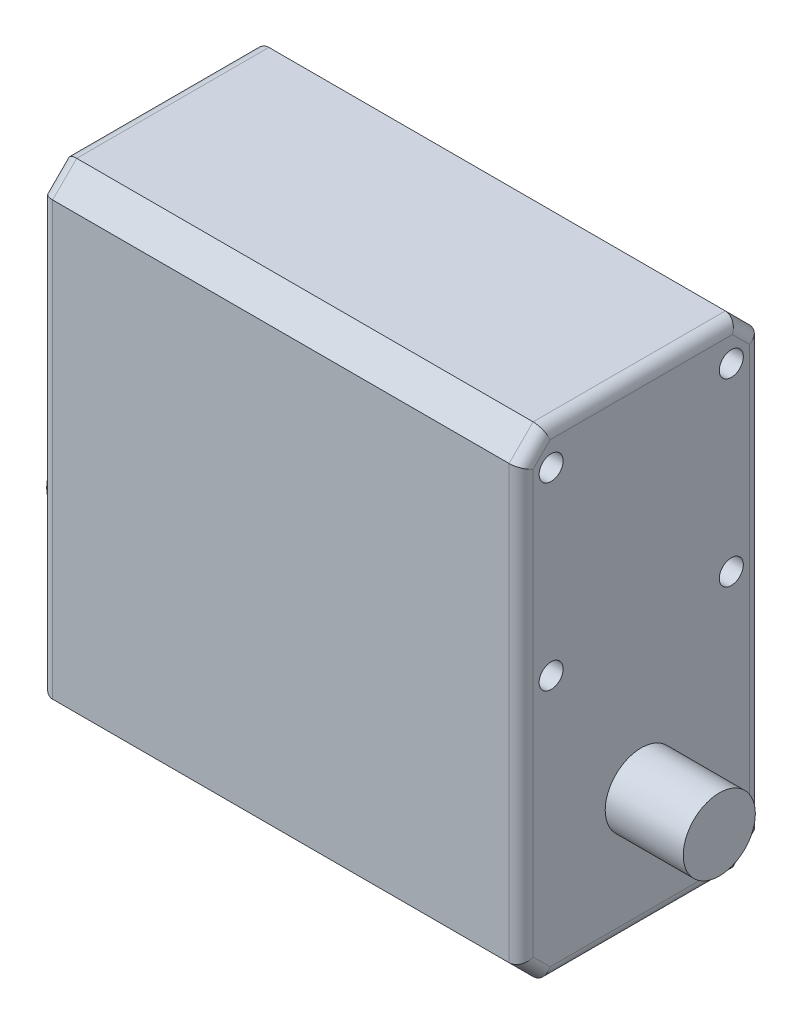
ISO-10303-21;
HEADER;
FILE_DESCRIPTION(('STEP AP214'),'2;1');
FILE_NAME('part.step','',(''),(''),'','','');
FILE_SCHEMA(('AUTOMOTIVE_DESIGN { 1 0 10303 214 1 1 1 1 }'));
ENDSEC;
DATA;
#1=APPLICATION_CONTEXT('core data for automotive mechanical design processes');
#2=APPLICATION_PROTOCOL_DEFINITION('international standard','automotive_design',2000,#1);
#3=PRODUCT_CONTEXT('',#1,'mechanical');
#4=PRODUCT('Part','Part','',(#3));
#5=PRODUCT_RELATED_PRODUCT_CATEGORY('part','',(#4));
#6=PRODUCT_DEFINITION_FORMATION('','',#4);
#7=PRODUCT_DEFINITION_CONTEXT('part definition',#1,'design');
#8=PRODUCT_DEFINITION('design','',#6,#7);
#9=PRODUCT_DEFINITION_SHAPE('','',#8);
#10=(LENGTH_UNIT() NAMED_UNIT(*) SI_UNIT(.MILLI.,.METRE.));
#11=(NAMED_UNIT(*) PLANE_ANGLE_UNIT() SI_UNIT($,.RADIAN.));
#12=(NAMED_UNIT(*) SI_UNIT($,.STERADIAN.) SOLID_ANGLE_UNIT());
#13=UNCERTAINTY_MEASURE_WITH_UNIT(LENGTH_MEASURE(1.E-05),#10,'distance_accuracy_value','');
#14=(GEOMETRIC_REPRESENTATION_CONTEXT(3) GLOBAL_UNCERTAINTY_ASSIGNED_CONTEXT((#13)) GLOBAL_UNIT_ASSIGNED_CONTEXT((#10,
#11,#12)) REPRESENTATION_CONTEXT('',''));
#15=CARTESIAN_POINT('',(0.,0.,0.));
#16=DIRECTION('',(0.,0.,1.));
#17=DIRECTION('',(1.,0.,0.));
#18=AXIS2_PLACEMENT_3D('',#15,#16,#17);
#19=CARTESIAN_POINT('',(45.,-0.752089136490247,16.5181058495822));
#20=DIRECTION('',(-1.,0.,0.));
#21=DIRECTION('',(0.,0.,1.));
#22=AXIS2_PLACEMENT_3D('',#19,#20,#21);
#23=CYLINDRICAL_SURFACE('',#22,3.);
#24=CARTESIAN_POINT('',(40.,-0.752089136490247,16.5181058495822));
#25=DIRECTION('',(-1.,0.,0.));
#26=DIRECTION('',(0.,0.,1.));
#27=AXIS2_PLACEMENT_3D('',#24,#25,#26);
#28=CIRCLE('',#27,3.);
#29=CARTESIAN_POINT('',(40.,-0.752089136490247,19.5181058495822));
#30=VERTEX_POINT('',#29);
#31=EDGE_CURVE('E263',#30,#30,#28,.T.);
#32=ORIENTED_EDGE('',*,*,#31,.F.);
#33=EDGE_LOOP('',(#32));
#34=FACE_BOUND('',#33,.T.);
#35=CARTESIAN_POINT('',(46.5,-0.752089136490247,16.5181058495822));
#36=DIRECTION('',(1.,0.,0.));
#37=DIRECTION('',(0.,0.,-1.));
#38=AXIS2_PLACEMENT_3D('',#35,#36,#37);
#39=CIRCLE('',#38,3.);
#40=CARTESIAN_POINT('',(46.5,-0.752089136490247,13.5181058495822));
#41=VERTEX_POINT('',#40);
#42=EDGE_CURVE('E43',#41,#41,#39,.F.);
#43=ORIENTED_EDGE('',*,*,#42,.T.);
#44=EDGE_LOOP('',(#43));
#45=FACE_BOUND('',#44,.T.);
#46=ADVANCED_FACE('F39',(#34,#45),#23,.T.);
#47=CARTESIAN_POINT('',(40.,0.,0.));
#48=DIRECTION('',(-1.,0.,0.));
#49=DIRECTION('',(0.,0.,1.));
#50=AXIS2_PLACEMENT_3D('',#47,#48,#49);
#51=PLANE('',#50);
#52=ORIENTED_EDGE('',*,*,#31,.T.);
#53=EDGE_LOOP('',(#52));
#54=FACE_BOUND('',#53,.T.);
#55=DIRECTION('',(0.,0.,-1.));
#56=VECTOR('',#55,1.);
#57=CARTESIAN_POINT('',(40.,-9.75208913649025,0.));
#58=LINE('',#57,#56);
#59=CARTESIAN_POINT('',(40.,-9.75208913649025,24.1038922872091));
#60=VERTEX_POINT('',#59);
#61=CARTESIAN_POINT('',(40.,-9.75208913649025,8.9323194119553));
#62=VERTEX_POINT('',#61);
#63=EDGE_CURVE('E55',#60,#62,#58,.T.);
#64=ORIENTED_EDGE('',*,*,#63,.T.);
#65=DIRECTION('',(0.,-0.707106781186547,0.707106781186548));
#66=VECTOR('',#65,1.);
#67=CARTESIAN_POINT('',(40.,-8.0449823553037,7.22521263076875));
#68=LINE('',#67,#66);
#69=CARTESIAN_POINT('',(40.,-8.33787557411715,7.5181058495822));
#70=VERTEX_POINT('',#69);
#71=EDGE_CURVE('E48',#62,#70,#68,.F.);
#72=ORIENTED_EDGE('',*,*,#71,.T.);
#73=DIRECTION('',(0.,1.,0.));
#74=VECTOR('',#73,1.);
#75=CARTESIAN_POINT('',(40.,0.,7.5181058495822));
#76=LINE('',#75,#74);
#77=CARTESIAN_POINT('',(40.,26.8336973011367,7.5181058495822));
#78=VERTEX_POINT('',#77);
#79=EDGE_CURVE('E230',#70,#78,#76,.T.);
#80=ORIENTED_EDGE('',*,*,#79,.T.);
#81=DIRECTION('',(0.,-0.707106781186548,-0.707106781186548));
#82=VECTOR('',#81,1.);
#83=CARTESIAN_POINT('',(40.,28.5408040823232,9.22521263076876));
#84=LINE('',#83,#82);
#85=CARTESIAN_POINT('',(40.,28.2479108635098,8.9323194119553));
#86=VERTEX_POINT('',#85);
#87=EDGE_CURVE('E232',#78,#86,#84,.F.);
#88=ORIENTED_EDGE('',*,*,#87,.T.);
#89=DIRECTION('',(0.,0.,1.));
#90=VECTOR('',#89,1.);
#91=CARTESIAN_POINT('',(40.,28.2479108635098,0.));
#92=LINE('',#91,#90);
#93=CARTESIAN_POINT('',(40.,28.2479108635098,24.1038922872091));
#94=VERTEX_POINT('',#93);
#95=EDGE_CURVE('E234',#86,#94,#92,.T.);
#96=ORIENTED_EDGE('',*,*,#95,.T.);
#97=DIRECTION('',(0.,0.707106781186548,-0.707106781186548));
#98=VECTOR('',#97,1.);
#99=CARTESIAN_POINT('',(40.,26.5408040823232,25.8109990683957));
#100=LINE('',#99,#98);
#101=CARTESIAN_POINT('',(40.,26.8336973011366,25.5181058495822));
#102=VERTEX_POINT('',#101);
#103=EDGE_CURVE('E236',#94,#102,#100,.F.);
#104=ORIENTED_EDGE('',*,*,#103,.T.);
#105=DIRECTION('',(0.,-1.,0.));
#106=VECTOR('',#105,1.);
#107=CARTESIAN_POINT('',(40.,0.,25.5181058495822));
#108=LINE('',#107,#106);
#109=CARTESIAN_POINT('',(40.,-8.33787557411715,25.5181058495822));
#110=VERTEX_POINT('',#109);
#111=EDGE_CURVE('E238',#102,#110,#108,.T.);
#112=ORIENTED_EDGE('',*,*,#111,.T.);
#113=DIRECTION('',(0.,0.707106781186547,0.707106781186548));
#114=VECTOR('',#113,1.);
#115=CARTESIAN_POINT('',(40.,-10.0449823553037,23.8109990683957));
#116=LINE('',#115,#114);
#117=EDGE_CURVE('E60',#110,#60,#116,.F.);
#118=ORIENTED_EDGE('',*,*,#117,.T.);
#119=EDGE_LOOP('',(#64,#72,#80,#88,#96,#104,#112,#118));
#120=FACE_BOUND('',#119,.T.);
#121=CARTESIAN_POINT('',(40.,11.2015398908567,9.0181058495822));
#122=DIRECTION('',(-1.,0.,0.));
#123=DIRECTION('',(0.,0.,1.));
#124=AXIS2_PLACEMENT_3D('',#121,#122,#123);
#125=CIRCLE('',#124,0.999999999999999);
#126=CARTESIAN_POINT('',(40.,11.2015398908567,10.0181058495822));
#127=VERTEX_POINT('',#126);
#128=EDGE_CURVE('E380',#127,#127,#125,.T.);
#129=ORIENTED_EDGE('',*,*,#128,.T.);
#130=EDGE_LOOP('',(#129));
#131=FACE_BOUND('',#130,.T.);
#132=CARTESIAN_POINT('',(40.,26.2015398908567,9.0181058495822));
#133=DIRECTION('',(-1.,0.,0.));
#134=DIRECTION('',(0.,0.,1.));
#135=AXIS2_PLACEMENT_3D('',#132,#133,#134);
#136=CIRCLE('',#135,1.);
#137=CARTESIAN_POINT('',(40.,26.2015398908567,10.0181058495822));
#138=VERTEX_POINT('',#137);
#139=EDGE_CURVE('E360',#138,#138,#136,.T.);
#140=ORIENTED_EDGE('',*,*,#139,.T.);
#141=EDGE_LOOP('',(#140));
#142=FACE_BOUND('',#141,.T.);
#143=CARTESIAN_POINT('',(40.,11.2015398908567,24.0181058495822));
#144=DIRECTION('',(-1.,0.,0.));
#145=DIRECTION('',(0.,0.,1.));
#146=AXIS2_PLACEMENT_3D('',#143,#144,#145);
#147=CIRCLE('',#146,0.999999999999998);
#148=CARTESIAN_POINT('',(40.,11.2015398908567,25.0181058495822));
#149=VERTEX_POINT('',#148);
#150=EDGE_CURVE('E374',#149,#149,#147,.F.);
#151=ORIENTED_EDGE('',*,*,#150,.F.);
#152=EDGE_LOOP('',(#151));
#153=FACE_BOUND('',#152,.T.);
#154=CARTESIAN_POINT('',(40.,26.2015398908567,24.0181058495822));
#155=DIRECTION('',(1.,0.,0.));
#156=DIRECTION('',(0.,0.,-1.));
#157=AXIS2_PLACEMENT_3D('',#154,#155,#156);
#158=CIRCLE('',#157,1.00000000000001);
#159=CARTESIAN_POINT('',(40.,26.2015398908567,23.0181058495822));
#160=VERTEX_POINT('',#159);
#161=EDGE_CURVE('E259',#160,#160,#158,.T.);
#162=ORIENTED_EDGE('',*,*,#161,.F.);
#163=EDGE_LOOP('',(#162));
#164=FACE_BOUND('',#163,.T.);
#165=ADVANCED_FACE('F405',(#54,#120,#131,#142,#153,#164),#51,.F.);
#166=CARTESIAN_POINT('',(0.,0.,0.));
#167=DIRECTION('',(-1.,0.,0.));
#168=DIRECTION('',(0.,0.,1.));
#169=AXIS2_PLACEMENT_3D('',#166,#167,#168);
#170=PLANE('',#169);
#171=CARTESIAN_POINT('',(0.,-0.752089136490247,16.5181058495822));
#172=DIRECTION('',(-1.,0.,0.));
#173=DIRECTION('',(0.,0.,1.));
#174=AXIS2_PLACEMENT_3D('',#171,#172,#173);
#175=CIRCLE('',#174,3.);
#176=CARTESIAN_POINT('',(0.,-0.752089136490247,19.5181058495822));
#177=VERTEX_POINT('',#176);
#178=EDGE_CURVE('E11',#177,#177,#175,.T.);
#179=ORIENTED_EDGE('',*,*,#178,.F.);
#180=EDGE_LOOP('',(#179));
#181=FACE_BOUND('',#180,.T.);
#182=DIRECTION('',(0.,-1.,0.));
#183=VECTOR('',#182,1.);
#184=CARTESIAN_POINT('',(0.,27.2479108635097,25.5181058495822));
#185=LINE('',#184,#183);
#186=CARTESIAN_POINT('',(0.,-8.33787557411715,25.5181058495822));
#187=VERTEX_POINT('',#186);
#188=CARTESIAN_POINT('',(0.,26.8336973011366,25.5181058495822));
#189=VERTEX_POINT('',#188);
#190=EDGE_CURVE('E158',#187,#189,#185,.F.);
#191=ORIENTED_EDGE('',*,*,#190,.T.);
#192=DIRECTION('',(0.,-0.707106781186548,0.707106781186548));
#193=VECTOR('',#192,1.);
#194=CARTESIAN_POINT('',(0.,26.1759015753594,26.1759015753594));
#195=LINE('',#194,#193);
#196=CARTESIAN_POINT('',(0.,28.2479108635097,24.1038922872091));
#197=VERTEX_POINT('',#196);
#198=EDGE_CURVE('E195',#189,#197,#195,.F.);
#199=ORIENTED_EDGE('',*,*,#198,.T.);
#200=DIRECTION('',(0.,0.,1.));
#201=VECTOR('',#200,1.);
#202=CARTESIAN_POINT('',(0.,28.2479108635098,8.51810584958221));
#203=LINE('',#202,#201);
#204=CARTESIAN_POINT('',(0.,28.2479108635098,8.9323194119553));
#205=VERTEX_POINT('',#204);
#206=EDGE_CURVE('E193',#197,#205,#203,.F.);
#207=ORIENTED_EDGE('',*,*,#206,.T.);
#208=DIRECTION('',(0.,0.707106781186548,0.707106781186548));
#209=VECTOR('',#208,1.);
#210=CARTESIAN_POINT('',(0.,9.65779572577723,-9.65779572577723));
#211=LINE('',#210,#209);
#212=CARTESIAN_POINT('',(0.,26.8336973011367,7.5181058495822));
#213=VERTEX_POINT('',#212);
#214=EDGE_CURVE('E191',#205,#213,#211,.F.);
#215=ORIENTED_EDGE('',*,*,#214,.T.);
#216=DIRECTION('',(0.,1.,0.));
#217=VECTOR('',#216,1.);
#218=CARTESIAN_POINT('',(0.,-8.75208913649025,7.5181058495822));
#219=LINE('',#218,#217);
#220=CARTESIAN_POINT('',(0.,-8.33787557411715,7.5181058495822));
#221=VERTEX_POINT('',#220);
#222=EDGE_CURVE('E189',#213,#221,#219,.F.);
#223=ORIENTED_EDGE('',*,*,#222,.T.);
#224=DIRECTION('',(0.,0.707106781186547,-0.707106781186548));
#225=VECTOR('',#224,1.);
#226=CARTESIAN_POINT('',(0.,-0.409884862267481,-0.409884862267481));
#227=LINE('',#226,#225);
#228=CARTESIAN_POINT('',(0.,-9.75208913649025,8.9323194119553));
#229=VERTEX_POINT('',#228);
#230=EDGE_CURVE('E187',#221,#229,#227,.F.);
#231=ORIENTED_EDGE('',*,*,#230,.T.);
#232=DIRECTION('',(0.,0.,-1.));
#233=VECTOR('',#232,1.);
#234=CARTESIAN_POINT('',(0.,-9.75208913649025,24.5181058495822));
#235=LINE('',#234,#233);
#236=CARTESIAN_POINT('',(0.,-9.75208913649025,24.1038922872091));
#237=VERTEX_POINT('',#236);
#238=EDGE_CURVE('E161',#229,#237,#235,.F.);
#239=ORIENTED_EDGE('',*,*,#238,.T.);
#240=DIRECTION('',(0.,-0.707106781186547,-0.707106781186548));
#241=VECTOR('',#240,1.);
#242=CARTESIAN_POINT('',(0.,-16.9279907118497,16.9279907118497));
#243=LINE('',#242,#241);
#244=EDGE_CURVE('E152',#237,#187,#243,.F.);
#245=ORIENTED_EDGE('',*,*,#244,.T.);
#246=EDGE_LOOP('',(#191,#199,#207,#215,#223,#231,#239,#245));
#247=FACE_BOUND('',#246,.T.);
#248=CARTESIAN_POINT('',(0.,11.2015398908567,24.0181058495822));
#249=DIRECTION('',(-1.,0.,0.));
#250=DIRECTION('',(0.,0.,1.));
#251=AXIS2_PLACEMENT_3D('',#248,#249,#250);
#252=CIRCLE('',#251,0.999999999999998);
#253=CARTESIAN_POINT('',(0.,11.2015398908567,25.0181058495822));
#254=VERTEX_POINT('',#253);
#255=EDGE_CURVE('E377',#254,#254,#252,.F.);
#256=ORIENTED_EDGE('',*,*,#255,.T.);
#257=EDGE_LOOP('',(#256));
#258=FACE_BOUND('',#257,.T.);
#259=CARTESIAN_POINT('',(0.,11.2015398908567,9.0181058495822));
#260=DIRECTION('',(-1.,0.,0.));
#261=DIRECTION('',(0.,0.,1.));
#262=AXIS2_PLACEMENT_3D('',#259,#260,#261);
#263=CIRCLE('',#262,0.999999999999999);
#264=CARTESIAN_POINT('',(0.,11.2015398908567,10.0181058495822));
#265=VERTEX_POINT('',#264);
#266=EDGE_CURVE('E367',#265,#265,#263,.T.);
#267=ORIENTED_EDGE('',*,*,#266,.F.);
#268=EDGE_LOOP('',(#267));
#269=FACE_BOUND('',#268,.T.);
#270=CARTESIAN_POINT('',(0.,26.2015398908567,9.0181058495822));
#271=DIRECTION('',(-1.,0.,0.));
#272=DIRECTION('',(0.,0.,1.));
#273=AXIS2_PLACEMENT_3D('',#270,#271,#272);
#274=CIRCLE('',#273,1.);
#275=CARTESIAN_POINT('',(0.,26.2015398908567,10.0181058495822));
#276=VERTEX_POINT('',#275);
#277=EDGE_CURVE('E363',#276,#276,#274,.T.);
#278=ORIENTED_EDGE('',*,*,#277,.F.);
#279=EDGE_LOOP('',(#278));
#280=FACE_BOUND('',#279,.T.);
#281=CARTESIAN_POINT('',(0.,26.2015398908567,24.0181058495822));
#282=DIRECTION('',(1.,0.,0.));
#283=DIRECTION('',(0.,0.,-1.));
#284=AXIS2_PLACEMENT_3D('',#281,#282,#283);
#285=CIRCLE('',#284,1.00000000000001);
#286=CARTESIAN_POINT('',(0.,26.2015398908567,23.0181058495822));
#287=VERTEX_POINT('',#286);
#288=EDGE_CURVE('E371',#287,#287,#285,.T.);
#289=ORIENTED_EDGE('',*,*,#288,.T.);
#290=EDGE_LOOP('',(#289));
#291=FACE_BOUND('',#290,.T.);
#292=ADVANCED_FACE('F154',(#181,#247,#258,#269,#280,#291),#170,.T.);
#293=CARTESIAN_POINT('',(40.,29.2479108635098,6.5181058495822));
#294=DIRECTION('',(0.,0.,1.));
#295=DIRECTION('',(0.,-1.,0.));
#296=AXIS2_PLACEMENT_3D('',#293,#294,#295);
#297=PLANE('',#296);
#298=DIRECTION('',(-1.,0.,0.));
#299=VECTOR('',#298,1.);
#300=CARTESIAN_POINT('',(40.,-8.75208913649025,6.5181058495822));
#301=LINE('',#300,#299);
#302=CARTESIAN_POINT('',(39.,-8.75208913649025,6.5181058495822));
#303=VERTEX_POINT('',#302);
#304=CARTESIAN_POINT('',(1.,-8.75208913649025,6.5181058495822));
#305=VERTEX_POINT('',#304);
#306=EDGE_CURVE('E306',#303,#305,#301,.T.);
#307=ORIENTED_EDGE('',*,*,#306,.T.);
#308=DIRECTION('',(0.,1.,0.));
#309=VECTOR('',#308,1.);
#310=CARTESIAN_POINT('',(1.,27.2479108635098,6.5181058495822));
#311=LINE('',#310,#309);
#312=CARTESIAN_POINT('',(1.,27.2479108635098,6.5181058495822));
#313=VERTEX_POINT('',#312);
#314=EDGE_CURVE('E212',#305,#313,#311,.T.);
#315=ORIENTED_EDGE('',*,*,#314,.T.);
#316=DIRECTION('',(1.,0.,0.));
#317=VECTOR('',#316,1.);
#318=CARTESIAN_POINT('',(40.,27.2479108635098,6.5181058495822));
#319=LINE('',#318,#317);
#320=CARTESIAN_POINT('',(39.,27.2479108635098,6.5181058495822));
#321=VERTEX_POINT('',#320);
#322=EDGE_CURVE('E310',#313,#321,#319,.T.);
#323=ORIENTED_EDGE('',*,*,#322,.T.);
#324=DIRECTION('',(0.,1.,0.));
#325=VECTOR('',#324,1.);
#326=CARTESIAN_POINT('',(39.,29.2479108635098,6.5181058495822));
#327=LINE('',#326,#325);
#328=EDGE_CURVE('E210',#321,#303,#327,.F.);
#329=ORIENTED_EDGE('',*,*,#328,.T.);
#330=EDGE_LOOP('',(#307,#315,#323,#329));
#331=FACE_BOUND('',#330,.T.);
#332=ADVANCED_FACE('F339',(#331),#297,.F.);
#333=CARTESIAN_POINT('',(40.,29.2479108635098,6.5181058495822));
#334=DIRECTION('',(0.,-1.,0.));
#335=DIRECTION('',(0.,0.,-1.));
#336=AXIS2_PLACEMENT_3D('',#333,#334,#335);
#337=PLANE('',#336);
#338=DIRECTION('',(-1.,0.,0.));
#339=VECTOR('',#338,1.);
#340=CARTESIAN_POINT('',(40.,29.2479108635098,8.51810584958221));
#341=LINE('',#340,#339);
#342=CARTESIAN_POINT('',(39.,29.2479108635098,8.51810584958221));
#343=VERTEX_POINT('',#342);
#344=CARTESIAN_POINT('',(1.,29.2479108635098,8.51810584958221));
#345=VERTEX_POINT('',#344);
#346=EDGE_CURVE('E307',#343,#345,#341,.T.);
#347=ORIENTED_EDGE('',*,*,#346,.T.);
#348=DIRECTION('',(0.,0.,1.));
#349=VECTOR('',#348,1.);
#350=CARTESIAN_POINT('',(1.,29.2479108635097,24.5181058495822));
#351=LINE('',#350,#349);
#352=CARTESIAN_POINT('',(1.,29.2479108635097,24.5181058495822));
#353=VERTEX_POINT('',#352);
#354=EDGE_CURVE('E204',#345,#353,#351,.T.);
#355=ORIENTED_EDGE('',*,*,#354,.T.);
#356=DIRECTION('',(1.,0.,0.));
#357=VECTOR('',#356,1.);
#358=CARTESIAN_POINT('',(40.,29.2479108635097,24.5181058495822));
#359=LINE('',#358,#357);
#360=CARTESIAN_POINT('',(39.,29.2479108635097,24.5181058495822));
#361=VERTEX_POINT('',#360);
#362=EDGE_CURVE('E297',#353,#361,#359,.T.);
#363=ORIENTED_EDGE('',*,*,#362,.T.);
#364=DIRECTION('',(0.,0.,1.));
#365=VECTOR('',#364,1.);
#366=CARTESIAN_POINT('',(39.,29.2479108635098,6.5181058495822));
#367=LINE('',#366,#365);
#368=EDGE_CURVE('E202',#361,#343,#367,.F.);
#369=ORIENTED_EDGE('',*,*,#368,.T.);
#370=EDGE_LOOP('',(#347,#355,#363,#369));
#371=FACE_BOUND('',#370,.T.);
#372=ADVANCED_FACE('F303',(#371),#337,.F.);
#373=CARTESIAN_POINT('',(40.,29.2479108635097,26.5181058495822));
#374=DIRECTION('',(0.,0.,-1.));
#375=DIRECTION('',(-1.,0.,0.));
#376=AXIS2_PLACEMENT_3D('',#373,#374,#375);
#377=PLANE('',#376);
#378=DIRECTION('',(-1.,0.,0.));
#379=VECTOR('',#378,1.);
#380=CARTESIAN_POINT('',(40.,27.2479108635097,26.5181058495822));
#381=LINE('',#380,#379);
#382=CARTESIAN_POINT('',(39.,27.2479108635097,26.5181058495822));
#383=VERTEX_POINT('',#382);
#384=CARTESIAN_POINT('',(1.,27.2479108635097,26.5181058495822));
#385=VERTEX_POINT('',#384);
#386=EDGE_CURVE('E300',#383,#385,#381,.T.);
#387=ORIENTED_EDGE('',*,*,#386,.T.);
#388=DIRECTION('',(0.,-1.,0.));
#389=VECTOR('',#388,1.);
#390=CARTESIAN_POINT('',(1.,-8.75208913649025,26.5181058495822));
#391=LINE('',#390,#389);
#392=CARTESIAN_POINT('',(1.,-8.75208913649025,26.5181058495822));
#393=VERTEX_POINT('',#392);
#394=EDGE_CURVE('E228',#385,#393,#391,.T.);
#395=ORIENTED_EDGE('',*,*,#394,.T.);
#396=DIRECTION('',(1.,0.,0.));
#397=VECTOR('',#396,1.);
#398=CARTESIAN_POINT('',(40.,-8.75208913649025,26.5181058495822));
#399=LINE('',#398,#397);
#400=CARTESIAN_POINT('',(39.,-8.75208913649025,26.5181058495822));
#401=VERTEX_POINT('',#400);
#402=EDGE_CURVE('E357',#393,#401,#399,.T.);
#403=ORIENTED_EDGE('',*,*,#402,.T.);
#404=DIRECTION('',(0.,-1.,0.));
#405=VECTOR('',#404,1.);
#406=CARTESIAN_POINT('',(39.,29.2479108635097,26.5181058495822));
#407=LINE('',#406,#405);
#408=EDGE_CURVE('E226',#401,#383,#407,.F.);
#409=ORIENTED_EDGE('',*,*,#408,.T.);
#410=EDGE_LOOP('',(#387,#395,#403,#409));
#411=FACE_BOUND('',#410,.T.);
#412=ADVANCED_FACE('F359',(#411),#377,.F.);
#413=CARTESIAN_POINT('',(40.,-10.7520891364902,6.5181058495822));
#414=DIRECTION('',(0.,1.,0.));
#415=DIRECTION('',(0.,0.,1.));
#416=AXIS2_PLACEMENT_3D('',#413,#414,#415);
#417=PLANE('',#416);
#418=DIRECTION('',(-1.,0.,0.));
#419=VECTOR('',#418,1.);
#420=CARTESIAN_POINT('',(40.,-10.7520891364902,24.5181058495822));
#421=LINE('',#420,#419);
#422=CARTESIAN_POINT('',(39.,-10.7520891364902,24.5181058495822));
#423=VERTEX_POINT('',#422);
#424=CARTESIAN_POINT('',(1.,-10.7520891364902,24.5181058495822));
#425=VERTEX_POINT('',#424);
#426=EDGE_CURVE('E182',#423,#425,#421,.T.);
#427=ORIENTED_EDGE('',*,*,#426,.T.);
#428=DIRECTION('',(0.,0.,-1.));
#429=VECTOR('',#428,1.);
#430=CARTESIAN_POINT('',(1.,-10.7520891364902,8.5181058495822));
#431=LINE('',#430,#429);
#432=CARTESIAN_POINT('',(1.,-10.7520891364902,8.5181058495822));
#433=VERTEX_POINT('',#432);
#434=EDGE_CURVE('E221',#425,#433,#431,.T.);
#435=ORIENTED_EDGE('',*,*,#434,.T.);
#436=DIRECTION('',(1.,0.,0.));
#437=VECTOR('',#436,1.);
#438=CARTESIAN_POINT('',(40.,-10.7520891364902,8.5181058495822));
#439=LINE('',#438,#437);
#440=CARTESIAN_POINT('',(39.,-10.7520891364902,8.5181058495822));
#441=VERTEX_POINT('',#440);
#442=EDGE_CURVE('E179',#433,#441,#439,.T.);
#443=ORIENTED_EDGE('',*,*,#442,.T.);
#444=DIRECTION('',(0.,0.,-1.));
#445=VECTOR('',#444,1.);
#446=CARTESIAN_POINT('',(39.,-10.7520891364902,6.5181058495822));
#447=LINE('',#446,#445);
#448=EDGE_CURVE('E219',#441,#423,#447,.F.);
#449=ORIENTED_EDGE('',*,*,#448,.T.);
#450=EDGE_LOOP('',(#427,#435,#443,#449));
#451=FACE_BOUND('',#450,.T.);
#452=ADVANCED_FACE('F320',(#451),#417,.F.);
#453=CARTESIAN_POINT('',(40.,26.2015398908567,9.0181058495822));
#454=DIRECTION('',(-1.,0.,0.));
#455=DIRECTION('',(0.,0.,1.));
#456=AXIS2_PLACEMENT_3D('',#453,#454,#455);
#457=CYLINDRICAL_SURFACE('',#456,1.);
#458=ORIENTED_EDGE('',*,*,#139,.F.);
#459=EDGE_LOOP('',(#458));
#460=FACE_BOUND('',#459,.T.);
#461=ORIENTED_EDGE('',*,*,#277,.T.);
#462=EDGE_LOOP('',(#461));
#463=FACE_BOUND('',#462,.T.);
#464=ADVANCED_FACE('F434',(#460,#463),#457,.F.);
#465=CARTESIAN_POINT('',(40.,11.2015398908567,9.0181058495822));
#466=DIRECTION('',(-1.,0.,0.));
#467=DIRECTION('',(0.,0.,1.));
#468=AXIS2_PLACEMENT_3D('',#465,#466,#467);
#469=CYLINDRICAL_SURFACE('',#468,0.999999999999999);
#470=ORIENTED_EDGE('',*,*,#128,.F.);
#471=EDGE_LOOP('',(#470));
#472=FACE_BOUND('',#471,.T.);
#473=ORIENTED_EDGE('',*,*,#266,.T.);
#474=EDGE_LOOP('',(#473));
#475=FACE_BOUND('',#474,.T.);
#476=ADVANCED_FACE('F568',(#472,#475),#469,.F.);
#477=CARTESIAN_POINT('',(40.,11.2015398908567,24.0181058495822));
#478=DIRECTION('',(-1.,0.,0.));
#479=DIRECTION('',(0.,0.,1.));
#480=AXIS2_PLACEMENT_3D('',#477,#478,#479);
#481=CYLINDRICAL_SURFACE('',#480,0.999999999999998);
#482=ORIENTED_EDGE('',*,*,#150,.T.);
#483=EDGE_LOOP('',(#482));
#484=FACE_BOUND('',#483,.T.);
#485=ORIENTED_EDGE('',*,*,#255,.F.);
#486=EDGE_LOOP('',(#485));
#487=FACE_BOUND('',#486,.T.);
#488=ADVANCED_FACE('F560',(#484,#487),#481,.F.);
#489=CARTESIAN_POINT('',(40.,26.2015398908567,24.0181058495822));
#490=DIRECTION('',(-1.,0.,0.));
#491=DIRECTION('',(0.,0.,1.));
#492=AXIS2_PLACEMENT_3D('',#489,#490,#491);
#493=CYLINDRICAL_SURFACE('',#492,1.00000000000001);
#494=ORIENTED_EDGE('',*,*,#161,.T.);
#495=EDGE_LOOP('',(#494));
#496=FACE_BOUND('',#495,.T.);
#497=ORIENTED_EDGE('',*,*,#288,.F.);
#498=EDGE_LOOP('',(#497));
#499=FACE_BOUND('',#498,.T.);
#500=ADVANCED_FACE('F446',(#496,#499),#493,.F.);
#501=CARTESIAN_POINT('',(40.,27.2479108635097,26.5181058495822));
#502=DIRECTION('',(0.,-0.707106781186547,-0.707106781186547));
#503=DIRECTION('',(-1.,0.,0.));
#504=AXIS2_PLACEMENT_3D('',#501,#502,#503);
#505=PLANE('',#504);
#506=ORIENTED_EDGE('',*,*,#362,.F.);
#507=DIRECTION('',(0.,0.707106781186548,-0.707106781186548));
#508=VECTOR('',#507,1.);
#509=CARTESIAN_POINT('',(1.,27.2479108635097,26.5181058495822));
#510=LINE('',#509,#508);
#511=EDGE_CURVE('E199',#353,#385,#510,.F.);
#512=ORIENTED_EDGE('',*,*,#511,.T.);
#513=ORIENTED_EDGE('',*,*,#386,.F.);
#514=DIRECTION('',(0.,-0.707106781186548,0.707106781186548));
#515=VECTOR('',#514,1.);
#516=CARTESIAN_POINT('',(39.,29.2479108635098,24.5181058495822));
#517=LINE('',#516,#515);
#518=EDGE_CURVE('E197',#383,#361,#517,.F.);
#519=ORIENTED_EDGE('',*,*,#518,.T.);
#520=EDGE_LOOP('',(#506,#512,#513,#519));
#521=FACE_BOUND('',#520,.T.);
#522=ADVANCED_FACE('F296',(#521),#505,.F.);
#523=CARTESIAN_POINT('',(40.,29.2479108635098,8.51810584958221));
#524=DIRECTION('',(0.,-0.707106781186547,0.707106781186547));
#525=DIRECTION('',(-1.,0.,0.));
#526=AXIS2_PLACEMENT_3D('',#523,#524,#525);
#527=PLANE('',#526);
#528=ORIENTED_EDGE('',*,*,#322,.F.);
#529=DIRECTION('',(0.,-0.707106781186548,-0.707106781186548));
#530=VECTOR('',#529,1.);
#531=CARTESIAN_POINT('',(1.,29.2479108635098,8.51810584958221));
#532=LINE('',#531,#530);
#533=EDGE_CURVE('E208',#313,#345,#532,.F.);
#534=ORIENTED_EDGE('',*,*,#533,.T.);
#535=ORIENTED_EDGE('',*,*,#346,.F.);
#536=DIRECTION('',(0.,0.707106781186548,0.707106781186548));
#537=VECTOR('',#536,1.);
#538=CARTESIAN_POINT('',(39.,27.2479108635098,6.51810584958221));
#539=LINE('',#538,#537);
#540=EDGE_CURVE('E206',#343,#321,#539,.F.);
#541=ORIENTED_EDGE('',*,*,#540,.T.);
#542=EDGE_LOOP('',(#528,#534,#535,#541));
#543=FACE_BOUND('',#542,.T.);
#544=ADVANCED_FACE('F445',(#543),#527,.F.);
#545=CARTESIAN_POINT('',(40.,-8.75208913649025,6.5181058495822));
#546=DIRECTION('',(0.,0.707106781186548,0.707106781186547));
#547=DIRECTION('',(-1.,0.,0.));
#548=AXIS2_PLACEMENT_3D('',#545,#546,#547);
#549=PLANE('',#548);
#550=ORIENTED_EDGE('',*,*,#442,.F.);
#551=DIRECTION('',(0.,-0.707106781186547,0.707106781186548));
#552=VECTOR('',#551,1.);
#553=CARTESIAN_POINT('',(1.,-8.75208913649025,6.5181058495822));
#554=LINE('',#553,#552);
#555=EDGE_CURVE('E217',#433,#305,#554,.F.);
#556=ORIENTED_EDGE('',*,*,#555,.T.);
#557=ORIENTED_EDGE('',*,*,#306,.F.);
#558=DIRECTION('',(0.,0.707106781186547,-0.707106781186548));
#559=VECTOR('',#558,1.);
#560=CARTESIAN_POINT('',(39.,-10.7520891364902,8.5181058495822));
#561=LINE('',#560,#559);
#562=EDGE_CURVE('E214',#303,#441,#561,.F.);
#563=ORIENTED_EDGE('',*,*,#562,.T.);
#564=EDGE_LOOP('',(#550,#556,#557,#563));
#565=FACE_BOUND('',#564,.T.);
#566=ADVANCED_FACE('F336',(#565),#549,.F.);
#567=CARTESIAN_POINT('',(40.,-10.7520891364902,24.5181058495822));
#568=DIRECTION('',(0.,0.707106781186548,-0.707106781186547));
#569=DIRECTION('',(-1.,0.,0.));
#570=AXIS2_PLACEMENT_3D('',#567,#568,#569);
#571=PLANE('',#570);
#572=ORIENTED_EDGE('',*,*,#402,.F.);
#573=DIRECTION('',(0.,0.707106781186547,0.707106781186548));
#574=VECTOR('',#573,1.);
#575=CARTESIAN_POINT('',(1.,-10.7520891364902,24.5181058495822));
#576=LINE('',#575,#574);
#577=EDGE_CURVE('E170',#393,#425,#576,.F.);
#578=ORIENTED_EDGE('',*,*,#577,.T.);
#579=ORIENTED_EDGE('',*,*,#426,.F.);
#580=DIRECTION('',(0.,-0.707106781186547,-0.707106781186548));
#581=VECTOR('',#580,1.);
#582=CARTESIAN_POINT('',(39.,-8.75208913649025,26.5181058495822));
#583=LINE('',#582,#581);
#584=EDGE_CURVE('E223',#423,#401,#583,.F.);
#585=ORIENTED_EDGE('',*,*,#584,.T.);
#586=EDGE_LOOP('',(#572,#578,#579,#585));
#587=FACE_BOUND('',#586,.T.);
#588=ADVANCED_FACE('F356',(#587),#571,.F.);
#589=CARTESIAN_POINT('',(1.,-0.40988486226748,-0.40988486226748));
#590=DIRECTION('',(0.,0.707106781186547,-0.707106781186548));
#591=DIRECTION('',(0.,0.707106781186548,0.707106781186547));
#592=AXIS2_PLACEMENT_3D('',#589,#590,#591);
#593=CYLINDRICAL_SURFACE('',#592,1.);
#594=CARTESIAN_POINT('',(1.,-8.33787557411715,7.5181058495822));
#595=DIRECTION('',(0.,0.923879532511287,-0.38268343236509));
#596=DIRECTION('',(0.,-0.38268343236509,-0.923879532511287));
#597=AXIS2_PLACEMENT_3D('',#594,#595,#596);
#598=ELLIPSE('',#597,1.08239220029239,1.);
#599=EDGE_CURVE('E253',#305,#221,#598,.T.);
#600=ORIENTED_EDGE('',*,*,#599,.F.);
#601=ORIENTED_EDGE('',*,*,#555,.F.);
#602=CARTESIAN_POINT('',(1.,-9.75208913649025,8.9323194119553));
#603=DIRECTION('',(0.,-0.38268343236509,0.923879532511287));
#604=DIRECTION('',(0.,0.923879532511287,0.38268343236509));
#605=AXIS2_PLACEMENT_3D('',#602,#603,#604);
#606=ELLIPSE('',#605,1.08239220029239,1.);
#607=EDGE_CURVE('E256',#229,#433,#606,.T.);
#608=ORIENTED_EDGE('',*,*,#607,.F.);
#609=ORIENTED_EDGE('',*,*,#230,.F.);
#610=EDGE_LOOP('',(#600,#601,#608,#609));
#611=FACE_BOUND('',#610,.T.);
#612=ADVANCED_FACE('F332',(#611),#593,.T.);
#613=CARTESIAN_POINT('',(1.,-9.75208913649025,6.5181058495822));
#614=DIRECTION('',(0.,0.,1.));
#615=DIRECTION('',(1.,0.,0.));
#616=AXIS2_PLACEMENT_3D('',#613,#614,#615);
#617=CYLINDRICAL_SURFACE('',#616,1.);
#618=ORIENTED_EDGE('',*,*,#607,.T.);
#619=ORIENTED_EDGE('',*,*,#434,.F.);
#620=CARTESIAN_POINT('',(1.,-9.75208913649025,24.1038922872091));
#621=DIRECTION('',(0.,-0.38268343236509,-0.923879532511287));
#622=DIRECTION('',(0.,-0.923879532511287,0.38268343236509));
#623=AXIS2_PLACEMENT_3D('',#620,#621,#622);
#624=ELLIPSE('',#623,1.08239220029239,1.);
#625=EDGE_CURVE('E251',#237,#425,#624,.F.);
#626=ORIENTED_EDGE('',*,*,#625,.F.);
#627=ORIENTED_EDGE('',*,*,#238,.F.);
#628=EDGE_LOOP('',(#618,#619,#626,#627));
#629=FACE_BOUND('',#628,.T.);
#630=ADVANCED_FACE('F326',(#629),#617,.T.);
#631=CARTESIAN_POINT('',(1.,29.2479108635098,7.5181058495822));
#632=DIRECTION('',(0.,-1.,0.));
#633=DIRECTION('',(0.,0.,-1.));
#634=AXIS2_PLACEMENT_3D('',#631,#632,#633);
#635=CYLINDRICAL_SURFACE('',#634,1.);
#636=ORIENTED_EDGE('',*,*,#599,.T.);
#637=ORIENTED_EDGE('',*,*,#222,.F.);
#638=CARTESIAN_POINT('',(1.,26.8336973011367,7.51810584958221));
#639=DIRECTION('',(0.,-0.923879532511287,-0.38268343236509));
#640=DIRECTION('',(0.,-0.38268343236509,0.923879532511287));
#641=AXIS2_PLACEMENT_3D('',#638,#639,#640);
#642=ELLIPSE('',#641,1.08239220029239,1.);
#643=EDGE_CURVE('E173',#313,#213,#642,.F.);
#644=ORIENTED_EDGE('',*,*,#643,.F.);
#645=ORIENTED_EDGE('',*,*,#314,.F.);
#646=EDGE_LOOP('',(#636,#637,#644,#645));
#647=FACE_BOUND('',#646,.T.);
#648=ADVANCED_FACE('F478',(#647),#635,.T.);
#649=CARTESIAN_POINT('',(1.,-16.9279907118497,16.9279907118497));
#650=DIRECTION('',(0.,-0.707106781186547,-0.707106781186548));
#651=DIRECTION('',(0.,0.707106781186548,-0.707106781186547));
#652=AXIS2_PLACEMENT_3D('',#649,#650,#651);
#653=CYLINDRICAL_SURFACE('',#652,1.);
#654=ORIENTED_EDGE('',*,*,#625,.T.);
#655=ORIENTED_EDGE('',*,*,#577,.F.);
#656=CARTESIAN_POINT('',(1.,-8.33787557411716,25.5181058495822));
#657=DIRECTION('',(0.,0.923879532511287,0.38268343236509));
#658=DIRECTION('',(0.,0.38268343236509,-0.923879532511287));
#659=AXIS2_PLACEMENT_3D('',#656,#657,#658);
#660=ELLIPSE('',#659,1.08239220029239,1.);
#661=EDGE_CURVE('E168',#187,#393,#660,.T.);
#662=ORIENTED_EDGE('',*,*,#661,.F.);
#663=ORIENTED_EDGE('',*,*,#244,.F.);
#664=EDGE_LOOP('',(#654,#655,#662,#663));
#665=FACE_BOUND('',#664,.T.);
#666=ADVANCED_FACE('F169',(#665),#653,.T.);
#667=CARTESIAN_POINT('',(1.,9.65779572577723,-9.65779572577723));
#668=DIRECTION('',(0.,0.707106781186548,0.707106781186548));
#669=DIRECTION('',(0.,-0.707106781186548,0.707106781186548));
#670=AXIS2_PLACEMENT_3D('',#667,#668,#669);
#671=CYLINDRICAL_SURFACE('',#670,1.);
#672=ORIENTED_EDGE('',*,*,#643,.T.);
#673=ORIENTED_EDGE('',*,*,#214,.F.);
#674=CARTESIAN_POINT('',(1.,28.2479108635098,8.9323194119553));
#675=DIRECTION('',(0.,0.38268343236509,0.923879532511287));
#676=DIRECTION('',(0.,0.923879532511287,-0.38268343236509));
#677=AXIS2_PLACEMENT_3D('',#674,#675,#676);
#678=ELLIPSE('',#677,1.08239220029239,1.);
#679=EDGE_CURVE('E174',#345,#205,#678,.T.);
#680=ORIENTED_EDGE('',*,*,#679,.F.);
#681=ORIENTED_EDGE('',*,*,#533,.F.);
#682=EDGE_LOOP('',(#672,#673,#680,#681));
#683=FACE_BOUND('',#682,.T.);
#684=ADVANCED_FACE('F472',(#683),#671,.T.);
#685=CARTESIAN_POINT('',(1.,29.2479108635097,25.5181058495822));
#686=DIRECTION('',(0.,1.,0.));
#687=DIRECTION('',(0.,0.,1.));
#688=AXIS2_PLACEMENT_3D('',#685,#686,#687);
#689=CYLINDRICAL_SURFACE('',#688,1.);
#690=ORIENTED_EDGE('',*,*,#661,.T.);
#691=ORIENTED_EDGE('',*,*,#394,.F.);
#692=CARTESIAN_POINT('',(1.,26.8336973011366,25.5181058495822));
#693=DIRECTION('',(0.,0.923879532511287,-0.38268343236509));
#694=DIRECTION('',(0.,0.38268343236509,0.923879532511287));
#695=AXIS2_PLACEMENT_3D('',#692,#693,#694);
#696=ELLIPSE('',#695,1.08239220029239,1.);
#697=EDGE_CURVE('E177',#189,#385,#696,.T.);
#698=ORIENTED_EDGE('',*,*,#697,.F.);
#699=ORIENTED_EDGE('',*,*,#190,.F.);
#700=EDGE_LOOP('',(#690,#691,#698,#699));
#701=FACE_BOUND('',#700,.T.);
#702=ADVANCED_FACE('F176',(#701),#689,.T.);
#703=CARTESIAN_POINT('',(1.,28.2479108635098,6.5181058495822));
#704=DIRECTION('',(0.,0.,-1.));
#705=DIRECTION('',(0.,1.,0.));
#706=AXIS2_PLACEMENT_3D('',#703,#704,#705);
#707=CYLINDRICAL_SURFACE('',#706,1.);
#708=ORIENTED_EDGE('',*,*,#679,.T.);
#709=ORIENTED_EDGE('',*,*,#206,.F.);
#710=CARTESIAN_POINT('',(1.,28.2479108635098,24.1038922872091));
#711=DIRECTION('',(0.,0.38268343236509,-0.923879532511287));
#712=DIRECTION('',(0.,-0.923879532511287,-0.38268343236509));
#713=AXIS2_PLACEMENT_3D('',#710,#711,#712);
#714=ELLIPSE('',#713,1.08239220029239,1.);
#715=EDGE_CURVE('E243',#353,#197,#714,.F.);
#716=ORIENTED_EDGE('',*,*,#715,.F.);
#717=ORIENTED_EDGE('',*,*,#354,.F.);
#718=EDGE_LOOP('',(#708,#709,#716,#717));
#719=FACE_BOUND('',#718,.T.);
#720=ADVANCED_FACE('F465',(#719),#707,.T.);
#721=CARTESIAN_POINT('',(1.,26.1759015753594,26.1759015753594));
#722=DIRECTION('',(0.,-0.707106781186548,0.707106781186548));
#723=DIRECTION('',(0.,-0.707106781186548,-0.707106781186548));
#724=AXIS2_PLACEMENT_3D('',#721,#722,#723);
#725=CYLINDRICAL_SURFACE('',#724,1.);
#726=ORIENTED_EDGE('',*,*,#697,.T.);
#727=ORIENTED_EDGE('',*,*,#511,.F.);
#728=ORIENTED_EDGE('',*,*,#715,.T.);
#729=ORIENTED_EDGE('',*,*,#198,.F.);
#730=EDGE_LOOP('',(#726,#727,#728,#729));
#731=FACE_BOUND('',#730,.T.);
#732=ADVANCED_FACE('F462',(#731),#725,.T.);
#733=CARTESIAN_POINT('',(39.,26.1759015753594,26.1759015753594));
#734=DIRECTION('',(0.,-0.707106781186548,0.707106781186548));
#735=DIRECTION('',(0.,-0.707106781186548,-0.707106781186548));
#736=AXIS2_PLACEMENT_3D('',#733,#734,#735);
#737=CYLINDRICAL_SURFACE('',#736,1.);
#738=CARTESIAN_POINT('',(39.,28.2479108635098,24.1038922872091));
#739=DIRECTION('',(0.,-0.38268343236509,0.923879532511287));
#740=DIRECTION('',(0.,0.923879532511287,0.38268343236509));
#741=AXIS2_PLACEMENT_3D('',#738,#739,#740);
#742=ELLIPSE('',#741,1.08239220029239,1.);
#743=EDGE_CURVE('E277',#361,#94,#742,.F.);
#744=ORIENTED_EDGE('',*,*,#743,.F.);
#745=ORIENTED_EDGE('',*,*,#518,.F.);
#746=CARTESIAN_POINT('',(39.,26.8336973011366,25.5181058495822));
#747=DIRECTION('',(0.,-0.923879532511287,0.38268343236509));
#748=DIRECTION('',(0.,0.38268343236509,0.923879532511287));
#749=AXIS2_PLACEMENT_3D('',#746,#747,#748);
#750=ELLIPSE('',#749,1.08239220029239,1.);
#751=EDGE_CURVE('E245',#102,#383,#750,.T.);
#752=ORIENTED_EDGE('',*,*,#751,.F.);
#753=ORIENTED_EDGE('',*,*,#103,.F.);
#754=EDGE_LOOP('',(#744,#745,#752,#753));
#755=FACE_BOUND('',#754,.T.);
#756=ADVANCED_FACE('F41',(#755),#737,.T.);
#757=CARTESIAN_POINT('',(39.,0.,25.5181058495822));
#758=DIRECTION('',(0.,-1.,0.));
#759=DIRECTION('',(0.,0.,-1.));
#760=AXIS2_PLACEMENT_3D('',#757,#758,#759);
#761=CYLINDRICAL_SURFACE('',#760,1.);
#762=ORIENTED_EDGE('',*,*,#751,.T.);
#763=ORIENTED_EDGE('',*,*,#408,.F.);
#764=CARTESIAN_POINT('',(39.,-8.33787557411715,25.5181058495822));
#765=DIRECTION('',(0.,-0.923879532511287,-0.38268343236509));
#766=DIRECTION('',(0.,-0.38268343236509,0.923879532511287));
#767=AXIS2_PLACEMENT_3D('',#764,#765,#766);
#768=ELLIPSE('',#767,1.08239220029239,1.);
#769=EDGE_CURVE('E274',#110,#401,#768,.T.);
#770=ORIENTED_EDGE('',*,*,#769,.F.);
#771=ORIENTED_EDGE('',*,*,#111,.F.);
#772=EDGE_LOOP('',(#762,#763,#770,#771));
#773=FACE_BOUND('',#772,.T.);
#774=ADVANCED_FACE('F285',(#773),#761,.T.);
#775=CARTESIAN_POINT('',(39.,28.2479108635098,0.));
#776=DIRECTION('',(0.,0.,1.));
#777=DIRECTION('',(0.,-1.,0.));
#778=AXIS2_PLACEMENT_3D('',#775,#776,#777);
#779=CYLINDRICAL_SURFACE('',#778,1.);
#780=ORIENTED_EDGE('',*,*,#743,.T.);
#781=ORIENTED_EDGE('',*,*,#95,.F.);
#782=CARTESIAN_POINT('',(39.,28.2479108635098,8.93231941195531));
#783=DIRECTION('',(0.,0.38268343236509,0.923879532511287));
#784=DIRECTION('',(0.,0.923879532511287,-0.38268343236509));
#785=AXIS2_PLACEMENT_3D('',#782,#783,#784);
#786=ELLIPSE('',#785,1.08239220029239,1.);
#787=EDGE_CURVE('E271',#343,#86,#786,.F.);
#788=ORIENTED_EDGE('',*,*,#787,.F.);
#789=ORIENTED_EDGE('',*,*,#368,.F.);
#790=EDGE_LOOP('',(#780,#781,#788,#789));
#791=FACE_BOUND('',#790,.T.);
#792=ADVANCED_FACE('F496',(#791),#779,.T.);
#793=CARTESIAN_POINT('',(39.,-16.9279907118497,16.9279907118497));
#794=DIRECTION('',(0.,-0.707106781186547,-0.707106781186548));
#795=DIRECTION('',(0.,0.707106781186548,-0.707106781186547));
#796=AXIS2_PLACEMENT_3D('',#793,#794,#795);
#797=CYLINDRICAL_SURFACE('',#796,1.);
#798=ORIENTED_EDGE('',*,*,#769,.T.);
#799=ORIENTED_EDGE('',*,*,#584,.F.);
#800=CARTESIAN_POINT('',(39.,-9.75208913649025,24.1038922872091));
#801=DIRECTION('',(0.,-0.38268343236509,-0.923879532511287));
#802=DIRECTION('',(0.,-0.923879532511287,0.38268343236509));
#803=AXIS2_PLACEMENT_3D('',#800,#801,#802);
#804=ELLIPSE('',#803,1.08239220029239,1.);
#805=EDGE_CURVE('E268',#60,#423,#804,.T.);
#806=ORIENTED_EDGE('',*,*,#805,.F.);
#807=ORIENTED_EDGE('',*,*,#117,.F.);
#808=EDGE_LOOP('',(#798,#799,#806,#807));
#809=FACE_BOUND('',#808,.T.);
#810=ADVANCED_FACE('F353',(#809),#797,.T.);
#811=CARTESIAN_POINT('',(39.,9.65779572577723,-9.65779572577723));
#812=DIRECTION('',(0.,0.707106781186548,0.707106781186548));
#813=DIRECTION('',(0.,-0.707106781186548,0.707106781186548));
#814=AXIS2_PLACEMENT_3D('',#811,#812,#813);
#815=CYLINDRICAL_SURFACE('',#814,1.);
#816=ORIENTED_EDGE('',*,*,#787,.T.);
#817=ORIENTED_EDGE('',*,*,#87,.F.);
#818=CARTESIAN_POINT('',(39.,26.8336973011367,7.51810584958221));
#819=DIRECTION('',(0.,0.923879532511287,0.38268343236509));
#820=DIRECTION('',(0.,0.38268343236509,-0.923879532511287));
#821=AXIS2_PLACEMENT_3D('',#818,#819,#820);
#822=ELLIPSE('',#821,1.08239220029239,1.);
#823=EDGE_CURVE('E265',#321,#78,#822,.F.);
#824=ORIENTED_EDGE('',*,*,#823,.F.);
#825=ORIENTED_EDGE('',*,*,#540,.F.);
#826=EDGE_LOOP('',(#816,#817,#824,#825));
#827=FACE_BOUND('',#826,.T.);
#828=ADVANCED_FACE('F490',(#827),#815,.T.);
#829=CARTESIAN_POINT('',(39.,-9.75208913649025,0.));
#830=DIRECTION('',(0.,0.,-1.));
#831=DIRECTION('',(-1.,0.,0.));
#832=AXIS2_PLACEMENT_3D('',#829,#830,#831);
#833=CYLINDRICAL_SURFACE('',#832,1.);
#834=ORIENTED_EDGE('',*,*,#805,.T.);
#835=ORIENTED_EDGE('',*,*,#448,.F.);
#836=CARTESIAN_POINT('',(39.,-9.75208913649025,8.9323194119553));
#837=DIRECTION('',(0.,0.38268343236509,-0.923879532511287));
#838=DIRECTION('',(0.,-0.923879532511287,-0.38268343236509));
#839=AXIS2_PLACEMENT_3D('',#836,#837,#838);
#840=ELLIPSE('',#839,1.08239220029239,1.);
#841=EDGE_CURVE('E262',#62,#441,#840,.T.);
#842=ORIENTED_EDGE('',*,*,#841,.F.);
#843=ORIENTED_EDGE('',*,*,#63,.F.);
#844=EDGE_LOOP('',(#834,#835,#842,#843));
#845=FACE_BOUND('',#844,.T.);
#846=ADVANCED_FACE('F351',(#845),#833,.T.);
#847=CARTESIAN_POINT('',(39.,0.,7.5181058495822));
#848=DIRECTION('',(0.,1.,0.));
#849=DIRECTION('',(0.,0.,1.));
#850=AXIS2_PLACEMENT_3D('',#847,#848,#849);
#851=CYLINDRICAL_SURFACE('',#850,1.);
#852=ORIENTED_EDGE('',*,*,#823,.T.);
#853=ORIENTED_EDGE('',*,*,#79,.F.);
#854=CARTESIAN_POINT('',(39.,-8.33787557411715,7.5181058495822));
#855=DIRECTION('',(0.,0.923879532511287,-0.38268343236509));
#856=DIRECTION('',(0.,0.38268343236509,0.923879532511287));
#857=AXIS2_PLACEMENT_3D('',#854,#855,#856);
#858=ELLIPSE('',#857,1.08239220029239,1.);
#859=EDGE_CURVE('E260',#303,#70,#858,.F.);
#860=ORIENTED_EDGE('',*,*,#859,.F.);
#861=ORIENTED_EDGE('',*,*,#328,.F.);
#862=EDGE_LOOP('',(#852,#853,#860,#861));
#863=FACE_BOUND('',#862,.T.);
#864=ADVANCED_FACE('F345',(#863),#851,.T.);
#865=CARTESIAN_POINT('',(39.,-0.40988486226748,-0.40988486226748));
#866=DIRECTION('',(0.,0.707106781186547,-0.707106781186548));
#867=DIRECTION('',(0.,0.707106781186548,0.707106781186547));
#868=AXIS2_PLACEMENT_3D('',#865,#866,#867);
#869=CYLINDRICAL_SURFACE('',#868,1.);
#870=ORIENTED_EDGE('',*,*,#841,.T.);
#871=ORIENTED_EDGE('',*,*,#562,.F.);
#872=ORIENTED_EDGE('',*,*,#859,.T.);
#873=ORIENTED_EDGE('',*,*,#71,.F.);
#874=EDGE_LOOP('',(#870,#871,#872,#873));
#875=FACE_BOUND('',#874,.T.);
#876=ADVANCED_FACE('F349',(#875),#869,.T.);
#877=ORIENTED_EDGE('',*,*,#178,.T.);
#878=EDGE_LOOP('',(#877));
#879=FACE_BOUND('',#878,.T.);
#880=CARTESIAN_POINT('',(-6.5,-0.752089136490247,16.5181058495822));
#881=DIRECTION('',(-1.,0.,0.));
#882=DIRECTION('',(0.,0.,1.));
#883=AXIS2_PLACEMENT_3D('',#880,#881,#882);
#884=CIRCLE('',#883,3.);
#885=CARTESIAN_POINT('',(-6.5,-0.752089136490247,19.5181058495822));
#886=VERTEX_POINT('',#885);
#887=EDGE_CURVE('E387',#886,#886,#884,.T.);
#888=ORIENTED_EDGE('',*,*,#887,.F.);
#889=EDGE_LOOP('',(#888));
#890=FACE_BOUND('',#889,.T.);
#891=ADVANCED_FACE('F402',(#879,#890),#23,.T.);
#892=CARTESIAN_POINT('',(-6.5,-0.752089136490247,16.5181058495822));
#893=DIRECTION('',(-1.,0.,0.));
#894=DIRECTION('',(0.,0.,1.));
#895=AXIS2_PLACEMENT_3D('',#892,#893,#894);
#896=PLANE('',#895);
#897=ORIENTED_EDGE('',*,*,#887,.T.);
#898=EDGE_LOOP('',(#897));
#899=FACE_BOUND('',#898,.T.);
#900=ADVANCED_FACE('F397',(#899),#896,.T.);
#901=CARTESIAN_POINT('',(46.5,3.10401616520606,25.5));
#902=DIRECTION('',(1.,0.,0.));
#903=DIRECTION('',(0.,0.,-1.));
#904=AXIS2_PLACEMENT_3D('',#901,#902,#903);
#905=PLANE('',#904);
#906=ORIENTED_EDGE('',*,*,#42,.F.);
#907=EDGE_LOOP('',(#906));
#908=FACE_BOUND('',#907,.T.);
#909=ADVANCED_FACE('F395',(#908),#905,.T.);
#910=CLOSED_SHELL('',(#46,#165,#292,#332,#372,#412,#452,#464,#476,#488,#500,#522,#544,#566,#588,
#612,#630,#648,#666,#684,#702,#720,#732,#756,#774,#792,#810,#828,#846,#864,#876,#891,#900,#909));
#911=MANIFOLD_SOLID_BREP('B2',#910);
#912=ADVANCED_BREP_SHAPE_REPRESENTATION('',(#18,#911),#14);
#913=SHAPE_DEFINITION_REPRESENTATION(#9,#912);
ENDSEC;
END-ISO-10303-21;
